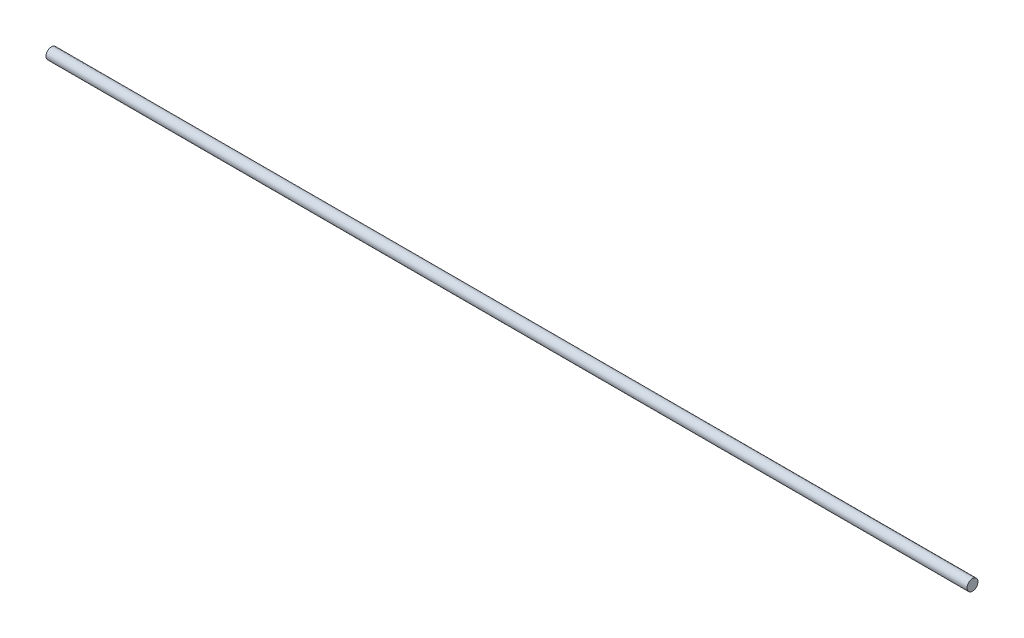
ISO-10303-21;
HEADER;
FILE_DESCRIPTION(('STEP AP214'),'2;1');
FILE_NAME('part.step','',(''),(''),'','','');
FILE_SCHEMA(('AUTOMOTIVE_DESIGN { 1 0 10303 214 1 1 1 1 }'));
ENDSEC;
DATA;
#1=APPLICATION_CONTEXT('core data for automotive mechanical design processes');
#2=APPLICATION_PROTOCOL_DEFINITION('international standard','automotive_design',2000,#1);
#3=PRODUCT_CONTEXT('',#1,'mechanical');
#4=PRODUCT('Part','Part','',(#3));
#5=PRODUCT_RELATED_PRODUCT_CATEGORY('part','',(#4));
#6=PRODUCT_DEFINITION_FORMATION('','',#4);
#7=PRODUCT_DEFINITION_CONTEXT('part definition',#1,'design');
#8=PRODUCT_DEFINITION('design','',#6,#7);
#9=PRODUCT_DEFINITION_SHAPE('','',#8);
#10=(LENGTH_UNIT() NAMED_UNIT(*) SI_UNIT(.MILLI.,.METRE.));
#11=(NAMED_UNIT(*) PLANE_ANGLE_UNIT() SI_UNIT($,.RADIAN.));
#12=(NAMED_UNIT(*) SI_UNIT($,.STERADIAN.) SOLID_ANGLE_UNIT());
#13=UNCERTAINTY_MEASURE_WITH_UNIT(LENGTH_MEASURE(1.E-05),#10,'distance_accuracy_value','');
#14=(GEOMETRIC_REPRESENTATION_CONTEXT(3) GLOBAL_UNCERTAINTY_ASSIGNED_CONTEXT((#13)) GLOBAL_UNIT_ASSIGNED_CONTEXT((#10,
#11,#12)) REPRESENTATION_CONTEXT('',''));
#15=CARTESIAN_POINT('',(0.,0.,0.));
#16=DIRECTION('',(0.,0.,1.));
#17=DIRECTION('',(1.,0.,0.));
#18=AXIS2_PLACEMENT_3D('',#15,#16,#17);
#19=CARTESIAN_POINT('',(800.1,0.,0.));
#20=DIRECTION('',(1.,0.,0.));
#21=DIRECTION('',(0.,0.,-1.));
#22=AXIS2_PLACEMENT_3D('',#19,#20,#21);
#23=PLANE('',#22);
#24=CARTESIAN_POINT('',(800.1,0.,0.));
#25=DIRECTION('',(1.,0.,0.));
#26=DIRECTION('',(0.,0.,-1.));
#27=AXIS2_PLACEMENT_3D('',#24,#25,#26);
#28=CIRCLE('',#27,4.7625);
#29=CARTESIAN_POINT('',(800.1,0.,-4.7625));
#30=VERTEX_POINT('',#29);
#31=EDGE_CURVE('E17',#30,#30,#28,.F.);
#32=ORIENTED_EDGE('',*,*,#31,.F.);
#33=EDGE_LOOP('',(#32));
#34=FACE_BOUND('',#33,.T.);
#35=ADVANCED_FACE('F14',(#34),#23,.T.);
#36=CARTESIAN_POINT('',(0.,0.,0.));
#37=DIRECTION('',(1.,0.,0.));
#38=DIRECTION('',(0.,0.,-1.));
#39=AXIS2_PLACEMENT_3D('',#36,#37,#38);
#40=PLANE('',#39);
#41=CARTESIAN_POINT('',(0.,0.,0.));
#42=DIRECTION('',(1.,0.,0.));
#43=DIRECTION('',(0.,0.,-1.));
#44=AXIS2_PLACEMENT_3D('',#41,#42,#43);
#45=CIRCLE('',#44,4.7625);
#46=CARTESIAN_POINT('',(0.,0.,-4.7625));
#47=VERTEX_POINT('',#46);
#48=EDGE_CURVE('E10',#47,#47,#45,.T.);
#49=ORIENTED_EDGE('',*,*,#48,.F.);
#50=EDGE_LOOP('',(#49));
#51=FACE_BOUND('',#50,.T.);
#52=ADVANCED_FACE('F29',(#51),#40,.F.);
#53=CARTESIAN_POINT('',(0.,0.,0.));
#54=DIRECTION('',(1.,0.,0.));
#55=DIRECTION('',(0.,0.,-1.));
#56=AXIS2_PLACEMENT_3D('',#53,#54,#55);
#57=CYLINDRICAL_SURFACE('',#56,4.7625);
#58=ORIENTED_EDGE('',*,*,#31,.T.);
#59=EDGE_LOOP('',(#58));
#60=FACE_BOUND('',#59,.T.);
#61=ORIENTED_EDGE('',*,*,#48,.T.);
#62=EDGE_LOOP('',(#61));
#63=FACE_BOUND('',#62,.T.);
#64=ADVANCED_FACE('F26',(#60,#63),#57,.T.);
#65=CLOSED_SHELL('',(#35,#52,#64));
#66=MANIFOLD_SOLID_BREP('B1',#65);
#67=ADVANCED_BREP_SHAPE_REPRESENTATION('',(#18,#66),#14);
#68=SHAPE_DEFINITION_REPRESENTATION(#9,#67);
ENDSEC;
END-ISO-10303-21;
